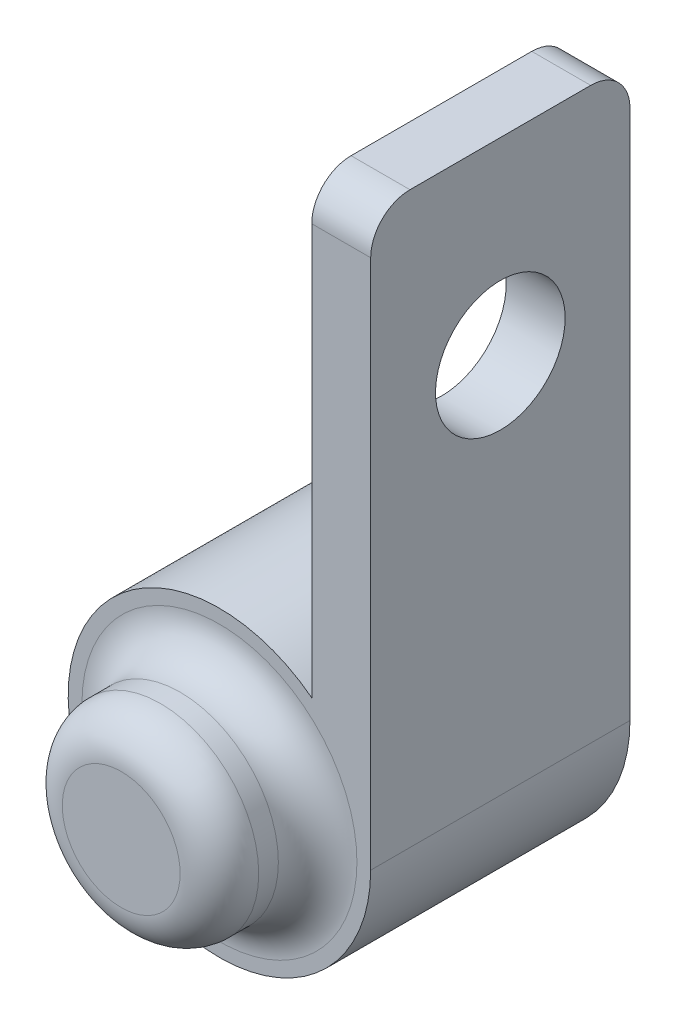
ISO-10303-21;
HEADER;
FILE_DESCRIPTION(('STEP AP214'),'2;1');
FILE_NAME('part.step','',(''),(''),'','','');
FILE_SCHEMA(('AUTOMOTIVE_DESIGN { 1 0 10303 214 1 1 1 1 }'));
ENDSEC;
DATA;
#1=APPLICATION_CONTEXT('core data for automotive mechanical design processes');
#2=APPLICATION_PROTOCOL_DEFINITION('international standard','automotive_design',2000,#1);
#3=PRODUCT_CONTEXT('',#1,'mechanical');
#4=PRODUCT('Part','Part','',(#3));
#5=PRODUCT_RELATED_PRODUCT_CATEGORY('part','',(#4));
#6=PRODUCT_DEFINITION_FORMATION('','',#4);
#7=PRODUCT_DEFINITION_CONTEXT('part definition',#1,'design');
#8=PRODUCT_DEFINITION('design','',#6,#7);
#9=PRODUCT_DEFINITION_SHAPE('','',#8);
#10=(LENGTH_UNIT() NAMED_UNIT(*) SI_UNIT(.MILLI.,.METRE.));
#11=(NAMED_UNIT(*) PLANE_ANGLE_UNIT() SI_UNIT($,.RADIAN.));
#12=(NAMED_UNIT(*) SI_UNIT($,.STERADIAN.) SOLID_ANGLE_UNIT());
#13=UNCERTAINTY_MEASURE_WITH_UNIT(LENGTH_MEASURE(1.E-05),#10,'distance_accuracy_value','');
#14=(GEOMETRIC_REPRESENTATION_CONTEXT(3) GLOBAL_UNCERTAINTY_ASSIGNED_CONTEXT((#13)) GLOBAL_UNIT_ASSIGNED_CONTEXT((#10,
#11,#12)) REPRESENTATION_CONTEXT('',''));
#15=CARTESIAN_POINT('',(0.,0.,0.));
#16=DIRECTION('',(0.,0.,1.));
#17=DIRECTION('',(1.,0.,0.));
#18=AXIS2_PLACEMENT_3D('',#15,#16,#17);
#19=CARTESIAN_POINT('',(0.,0.,6.6));
#20=DIRECTION('',(0.,0.,-1.));
#21=DIRECTION('',(-1.,0.,0.));
#22=AXIS2_PLACEMENT_3D('',#19,#20,#21);
#23=CYLINDRICAL_SURFACE('',#22,3.85);
#24=CARTESIAN_POINT('',(0.,0.,6.6));
#25=DIRECTION('',(0.,0.,1.));
#26=DIRECTION('',(1.,0.,0.));
#27=AXIS2_PLACEMENT_3D('',#24,#25,#26);
#28=CIRCLE('',#27,3.85);
#29=CARTESIAN_POINT('',(2.35,3.04959013639538,6.6));
#30=VERTEX_POINT('',#29);
#31=CARTESIAN_POINT('',(3.85,0.,6.6));
#32=VERTEX_POINT('',#31);
#33=EDGE_CURVE('E101',#30,#32,#28,.T.);
#34=ORIENTED_EDGE('',*,*,#33,.F.);
#35=DIRECTION('',(0.,0.,1.));
#36=VECTOR('',#35,1.);
#37=CARTESIAN_POINT('',(2.35,3.04959013639538,-14.5773797371133));
#38=LINE('',#37,#36);
#39=CARTESIAN_POINT('',(2.35,3.04959013639538,0.));
#40=VERTEX_POINT('',#39);
#41=EDGE_CURVE('E105',#40,#30,#38,.T.);
#42=ORIENTED_EDGE('',*,*,#41,.F.);
#43=CARTESIAN_POINT('',(0.,0.,0.));
#44=DIRECTION('',(0.,0.,1.));
#45=DIRECTION('',(1.,0.,0.));
#46=AXIS2_PLACEMENT_3D('',#43,#44,#45);
#47=CIRCLE('',#46,3.85);
#48=CARTESIAN_POINT('',(3.85,0.,0.));
#49=VERTEX_POINT('',#48);
#50=EDGE_CURVE('E92',#40,#49,#47,.T.);
#51=ORIENTED_EDGE('',*,*,#50,.T.);
#52=DIRECTION('',(0.,0.,1.));
#53=VECTOR('',#52,1.);
#54=CARTESIAN_POINT('',(3.85,0.,-14.5773797371133));
#55=LINE('',#54,#53);
#56=EDGE_CURVE('E125',#49,#32,#55,.T.);
#57=ORIENTED_EDGE('',*,*,#56,.T.);
#58=EDGE_LOOP('',(#34,#42,#51,#57));
#59=FACE_BOUND('',#58,.T.);
#60=ADVANCED_FACE('F37',(#59),#23,.T.);
#61=CARTESIAN_POINT('',(0.,0.,6.6));
#62=DIRECTION('',(0.,0.,1.));
#63=DIRECTION('',(1.,0.,0.));
#64=AXIS2_PLACEMENT_3D('',#61,#62,#63);
#65=PLANE('',#64);
#66=CARTESIAN_POINT('',(0.,0.,6.6));
#67=DIRECTION('',(0.,0.,1.));
#68=DIRECTION('',(1.,0.,0.));
#69=AXIS2_PLACEMENT_3D('',#66,#67,#68);
#70=CIRCLE('',#69,3.5);
#71=CARTESIAN_POINT('',(3.5,0.,6.6));
#72=VERTEX_POINT('',#71);
#73=EDGE_CURVE('E138',#72,#72,#70,.F.);
#74=ORIENTED_EDGE('',*,*,#73,.T.);
#75=EDGE_LOOP('',(#74));
#76=FACE_BOUND('',#75,.T.);
#77=DIRECTION('',(0.,1.,0.));
#78=VECTOR('',#77,1.);
#79=CARTESIAN_POINT('',(3.85,0.,6.6));
#80=LINE('',#79,#78);
#81=CARTESIAN_POINT('',(3.85,13.5,6.6));
#82=VERTEX_POINT('',#81);
#83=EDGE_CURVE('E120',#32,#82,#80,.T.);
#84=ORIENTED_EDGE('',*,*,#83,.T.);
#85=DIRECTION('',(-1.,0.,0.));
#86=VECTOR('',#85,1.);
#87=CARTESIAN_POINT('',(0.,13.5,6.6));
#88=LINE('',#87,#86);
#89=CARTESIAN_POINT('',(2.35,13.5,6.6));
#90=VERTEX_POINT('',#89);
#91=EDGE_CURVE('E144',#82,#90,#88,.T.);
#92=ORIENTED_EDGE('',*,*,#91,.T.);
#93=DIRECTION('',(0.,-1.,0.));
#94=VECTOR('',#93,1.);
#95=CARTESIAN_POINT('',(2.35,14.5,6.6));
#96=LINE('',#95,#94);
#97=EDGE_CURVE('E123',#90,#30,#96,.T.);
#98=ORIENTED_EDGE('',*,*,#97,.T.);
#99=ORIENTED_EDGE('',*,*,#33,.T.);
#100=EDGE_LOOP('',(#84,#92,#98,#99));
#101=FACE_BOUND('',#100,.T.);
#102=ADVANCED_FACE('F162',(#76,#101),#65,.T.);
#103=CARTESIAN_POINT('',(0.,0.,0.));
#104=DIRECTION('',(0.,0.,1.));
#105=DIRECTION('',(1.,0.,0.));
#106=AXIS2_PLACEMENT_3D('',#103,#104,#105);
#107=PLANE('',#106);
#108=DIRECTION('',(0.,1.,0.));
#109=VECTOR('',#108,1.);
#110=CARTESIAN_POINT('',(2.35,14.5,0.));
#111=LINE('',#110,#109);
#112=CARTESIAN_POINT('',(2.35,13.5,0.));
#113=VERTEX_POINT('',#112);
#114=EDGE_CURVE('E96',#40,#113,#111,.T.);
#115=ORIENTED_EDGE('',*,*,#114,.T.);
#116=DIRECTION('',(1.,0.,0.));
#117=VECTOR('',#116,1.);
#118=CARTESIAN_POINT('',(3.85,13.5,0.));
#119=LINE('',#118,#117);
#120=CARTESIAN_POINT('',(3.85,13.5,0.));
#121=VERTEX_POINT('',#120);
#122=EDGE_CURVE('E12',#113,#121,#119,.T.);
#123=ORIENTED_EDGE('',*,*,#122,.T.);
#124=DIRECTION('',(0.,-1.,0.));
#125=VECTOR('',#124,1.);
#126=CARTESIAN_POINT('',(3.85,0.,0.));
#127=LINE('',#126,#125);
#128=EDGE_CURVE('E98',#121,#49,#127,.T.);
#129=ORIENTED_EDGE('',*,*,#128,.T.);
#130=ORIENTED_EDGE('',*,*,#50,.F.);
#131=EDGE_LOOP('',(#115,#123,#129,#130));
#132=FACE_BOUND('',#131,.T.);
#133=ADVANCED_FACE('F94',(#132),#107,.F.);
#134=CARTESIAN_POINT('',(2.35,14.5,-14.5773797371133));
#135=DIRECTION('',(-1.,0.,0.));
#136=DIRECTION('',(0.,-1.,0.));
#137=AXIS2_PLACEMENT_3D('',#134,#135,#136);
#138=PLANE('',#137);
#139=CARTESIAN_POINT('',(2.35,9.7,3.3));
#140=DIRECTION('',(-1.,0.,0.));
#141=DIRECTION('',(0.,-1.,0.));
#142=AXIS2_PLACEMENT_3D('',#139,#140,#141);
#143=CIRCLE('',#142,1.65);
#144=CARTESIAN_POINT('',(2.35,8.05,3.3));
#145=VERTEX_POINT('',#144);
#146=EDGE_CURVE('E119',#145,#145,#143,.T.);
#147=ORIENTED_EDGE('',*,*,#146,.F.);
#148=EDGE_LOOP('',(#147));
#149=FACE_BOUND('',#148,.T.);
#150=ORIENTED_EDGE('',*,*,#97,.F.);
#151=CARTESIAN_POINT('',(2.35,13.5,5.6));
#152=DIRECTION('',(-1.,0.,0.));
#153=DIRECTION('',(0.,-1.,0.));
#154=AXIS2_PLACEMENT_3D('',#151,#152,#153);
#155=CIRCLE('',#154,1.);
#156=CARTESIAN_POINT('',(2.35,14.5,5.6));
#157=VERTEX_POINT('',#156);
#158=EDGE_CURVE('E150',#90,#157,#155,.T.);
#159=ORIENTED_EDGE('',*,*,#158,.T.);
#160=DIRECTION('',(0.,0.,1.));
#161=VECTOR('',#160,1.);
#162=CARTESIAN_POINT('',(2.35,14.5,-14.5773797371133));
#163=LINE('',#162,#161);
#164=CARTESIAN_POINT('',(2.35,14.5,0.999999999999999));
#165=VERTEX_POINT('',#164);
#166=EDGE_CURVE('E109',#165,#157,#163,.T.);
#167=ORIENTED_EDGE('',*,*,#166,.F.);
#168=CARTESIAN_POINT('',(2.35,13.5,1.));
#169=DIRECTION('',(-1.,0.,0.));
#170=DIRECTION('',(0.,-1.,0.));
#171=AXIS2_PLACEMENT_3D('',#168,#169,#170);
#172=CIRCLE('',#171,1.);
#173=EDGE_CURVE('E114',#165,#113,#172,.T.);
#174=ORIENTED_EDGE('',*,*,#173,.T.);
#175=ORIENTED_EDGE('',*,*,#114,.F.);
#176=ORIENTED_EDGE('',*,*,#41,.T.);
#177=EDGE_LOOP('',(#150,#159,#167,#174,#175,#176));
#178=FACE_BOUND('',#177,.T.);
#179=ADVANCED_FACE('F111',(#149,#178),#138,.T.);
#180=CARTESIAN_POINT('',(3.85,14.5,-14.5773797371133));
#181=DIRECTION('',(0.,1.,0.));
#182=DIRECTION('',(0.,0.,1.));
#183=AXIS2_PLACEMENT_3D('',#180,#181,#182);
#184=PLANE('',#183);
#185=ORIENTED_EDGE('',*,*,#166,.T.);
#186=DIRECTION('',(-1.,0.,0.));
#187=VECTOR('',#186,1.);
#188=CARTESIAN_POINT('',(3.85,14.5,5.6));
#189=LINE('',#188,#187);
#190=CARTESIAN_POINT('',(3.85,14.5,5.6));
#191=VERTEX_POINT('',#190);
#192=EDGE_CURVE('E59',#157,#191,#189,.F.);
#193=ORIENTED_EDGE('',*,*,#192,.T.);
#194=DIRECTION('',(0.,0.,1.));
#195=VECTOR('',#194,1.);
#196=CARTESIAN_POINT('',(3.85,14.5,-14.5773797371133));
#197=LINE('',#196,#195);
#198=CARTESIAN_POINT('',(3.85,14.5,0.999999999999999));
#199=VERTEX_POINT('',#198);
#200=EDGE_CURVE('E128',#199,#191,#197,.T.);
#201=ORIENTED_EDGE('',*,*,#200,.F.);
#202=DIRECTION('',(1.,0.,0.));
#203=VECTOR('',#202,1.);
#204=CARTESIAN_POINT('',(2.35,14.5,1.));
#205=LINE('',#204,#203);
#206=EDGE_CURVE('E152',#199,#165,#205,.F.);
#207=ORIENTED_EDGE('',*,*,#206,.T.);
#208=EDGE_LOOP('',(#185,#193,#201,#207));
#209=FACE_BOUND('',#208,.T.);
#210=ADVANCED_FACE('F164',(#209),#184,.T.);
#211=CARTESIAN_POINT('',(3.85,0.,-14.5773797371133));
#212=DIRECTION('',(1.,0.,0.));
#213=DIRECTION('',(0.,0.,-1.));
#214=AXIS2_PLACEMENT_3D('',#211,#212,#213);
#215=PLANE('',#214);
#216=CARTESIAN_POINT('',(3.85,9.7,3.3));
#217=DIRECTION('',(1.,0.,0.));
#218=DIRECTION('',(0.,0.,-1.));
#219=AXIS2_PLACEMENT_3D('',#216,#217,#218);
#220=CIRCLE('',#219,1.65);
#221=CARTESIAN_POINT('',(3.85,9.7,1.65));
#222=VERTEX_POINT('',#221);
#223=EDGE_CURVE('E124',#222,#222,#220,.T.);
#224=ORIENTED_EDGE('',*,*,#223,.F.);
#225=EDGE_LOOP('',(#224));
#226=FACE_BOUND('',#225,.T.);
#227=ORIENTED_EDGE('',*,*,#200,.T.);
#228=CARTESIAN_POINT('',(3.85,13.5,5.6));
#229=DIRECTION('',(1.,0.,0.));
#230=DIRECTION('',(0.,0.,-1.));
#231=AXIS2_PLACEMENT_3D('',#228,#229,#230);
#232=CIRCLE('',#231,1.);
#233=EDGE_CURVE('E45',#191,#82,#232,.T.);
#234=ORIENTED_EDGE('',*,*,#233,.T.);
#235=ORIENTED_EDGE('',*,*,#83,.F.);
#236=ORIENTED_EDGE('',*,*,#56,.F.);
#237=ORIENTED_EDGE('',*,*,#128,.F.);
#238=CARTESIAN_POINT('',(3.85,13.5,1.));
#239=DIRECTION('',(1.,0.,0.));
#240=DIRECTION('',(0.,0.,-1.));
#241=AXIS2_PLACEMENT_3D('',#238,#239,#240);
#242=CIRCLE('',#241,1.);
#243=EDGE_CURVE('E52',#121,#199,#242,.T.);
#244=ORIENTED_EDGE('',*,*,#243,.T.);
#245=EDGE_LOOP('',(#227,#234,#235,#236,#237,#244));
#246=FACE_BOUND('',#245,.T.);
#247=ADVANCED_FACE('F158',(#226,#246),#215,.T.);
#248=CARTESIAN_POINT('',(0.,0.,25.2710678118655));
#249=DIRECTION('',(0.,0.,-1.));
#250=DIRECTION('',(-1.,0.,0.));
#251=AXIS2_PLACEMENT_3D('',#248,#249,#250);
#252=CYLINDRICAL_SURFACE('',#251,2.5);
#253=CARTESIAN_POINT('',(0.,0.,7.6));
#254=DIRECTION('',(0.,0.,1.));
#255=DIRECTION('',(1.,0.,0.));
#256=AXIS2_PLACEMENT_3D('',#253,#254,#255);
#257=CIRCLE('',#256,2.5);
#258=CARTESIAN_POINT('',(2.5,0.,7.6));
#259=VERTEX_POINT('',#258);
#260=EDGE_CURVE('E135',#259,#259,#257,.T.);
#261=ORIENTED_EDGE('',*,*,#260,.T.);
#262=EDGE_LOOP('',(#261));
#263=FACE_BOUND('',#262,.T.);
#264=CARTESIAN_POINT('',(0.,0.,8.1));
#265=DIRECTION('',(0.,0.,1.));
#266=DIRECTION('',(1.,0.,0.));
#267=AXIS2_PLACEMENT_3D('',#264,#265,#266);
#268=CIRCLE('',#267,2.5);
#269=CARTESIAN_POINT('',(2.5,0.,8.1));
#270=VERTEX_POINT('',#269);
#271=EDGE_CURVE('E131',#270,#270,#268,.F.);
#272=ORIENTED_EDGE('',*,*,#271,.T.);
#273=EDGE_LOOP('',(#272));
#274=FACE_BOUND('',#273,.T.);
#275=ADVANCED_FACE('F197',(#263,#274),#252,.T.);
#276=CARTESIAN_POINT('',(0.,0.,9.1));
#277=DIRECTION('',(0.,0.,1.));
#278=DIRECTION('',(1.,0.,0.));
#279=AXIS2_PLACEMENT_3D('',#276,#277,#278);
#280=PLANE('',#279);
#281=CARTESIAN_POINT('',(0.,0.,9.1));
#282=DIRECTION('',(0.,0.,1.));
#283=DIRECTION('',(1.,0.,0.));
#284=AXIS2_PLACEMENT_3D('',#281,#282,#283);
#285=CIRCLE('',#284,1.5);
#286=CARTESIAN_POINT('',(1.5,0.,9.1));
#287=VERTEX_POINT('',#286);
#288=EDGE_CURVE('E141',#287,#287,#285,.T.);
#289=ORIENTED_EDGE('',*,*,#288,.T.);
#290=EDGE_LOOP('',(#289));
#291=FACE_BOUND('',#290,.T.);
#292=ADVANCED_FACE('F183',(#291),#280,.T.);
#293=CARTESIAN_POINT('',(0.,0.,7.6));
#294=DIRECTION('',(0.,0.,1.));
#295=DIRECTION('',(1.,0.,0.));
#296=AXIS2_PLACEMENT_3D('',#293,#294,#295);
#297=TOROIDAL_SURFACE('',#296,3.5,1.);
#298=ORIENTED_EDGE('',*,*,#73,.F.);
#299=EDGE_LOOP('',(#298));
#300=FACE_BOUND('',#299,.T.);
#301=ORIENTED_EDGE('',*,*,#260,.F.);
#302=EDGE_LOOP('',(#301));
#303=FACE_BOUND('',#302,.T.);
#304=ADVANCED_FACE('F179',(#300,#303),#297,.F.);
#305=CARTESIAN_POINT('',(0.,0.,8.1));
#306=DIRECTION('',(0.,0.,1.));
#307=DIRECTION('',(1.,0.,0.));
#308=AXIS2_PLACEMENT_3D('',#305,#306,#307);
#309=TOROIDAL_SURFACE('',#308,1.5,1.);
#310=ORIENTED_EDGE('',*,*,#271,.F.);
#311=EDGE_LOOP('',(#310));
#312=FACE_BOUND('',#311,.T.);
#313=ORIENTED_EDGE('',*,*,#288,.F.);
#314=EDGE_LOOP('',(#313));
#315=FACE_BOUND('',#314,.T.);
#316=ADVANCED_FACE('F182',(#312,#315),#309,.T.);
#317=CARTESIAN_POINT('',(12.95,9.7,3.3));
#318=DIRECTION('',(-1.,0.,0.));
#319=DIRECTION('',(0.,-1.,0.));
#320=AXIS2_PLACEMENT_3D('',#317,#318,#319);
#321=CYLINDRICAL_SURFACE('',#320,1.65);
#322=ORIENTED_EDGE('',*,*,#223,.T.);
#323=EDGE_LOOP('',(#322));
#324=FACE_BOUND('',#323,.T.);
#325=ORIENTED_EDGE('',*,*,#146,.T.);
#326=EDGE_LOOP('',(#325));
#327=FACE_BOUND('',#326,.T.);
#328=ADVANCED_FACE('F169',(#324,#327),#321,.F.);
#329=CARTESIAN_POINT('',(0.,13.5,5.6));
#330=DIRECTION('',(-1.,0.,0.));
#331=DIRECTION('',(0.,0.,1.));
#332=AXIS2_PLACEMENT_3D('',#329,#330,#331);
#333=CYLINDRICAL_SURFACE('',#332,1.);
#334=ORIENTED_EDGE('',*,*,#233,.F.);
#335=ORIENTED_EDGE('',*,*,#192,.F.);
#336=ORIENTED_EDGE('',*,*,#158,.F.);
#337=ORIENTED_EDGE('',*,*,#91,.F.);
#338=EDGE_LOOP('',(#334,#335,#336,#337));
#339=FACE_BOUND('',#338,.T.);
#340=ADVANCED_FACE('F163',(#339),#333,.T.);
#341=CARTESIAN_POINT('',(0.,13.5,1.));
#342=DIRECTION('',(-1.,0.,0.));
#343=DIRECTION('',(0.,0.,1.));
#344=AXIS2_PLACEMENT_3D('',#341,#342,#343);
#345=CYLINDRICAL_SURFACE('',#344,1.);
#346=ORIENTED_EDGE('',*,*,#173,.F.);
#347=ORIENTED_EDGE('',*,*,#206,.F.);
#348=ORIENTED_EDGE('',*,*,#243,.F.);
#349=ORIENTED_EDGE('',*,*,#122,.F.);
#350=EDGE_LOOP('',(#346,#347,#348,#349));
#351=FACE_BOUND('',#350,.T.);
#352=ADVANCED_FACE('F39',(#351),#345,.T.);
#353=CLOSED_SHELL('',(#60,#102,#133,#179,#210,#247,#275,#292,#304,#316,#328,#340,#352));
#354=MANIFOLD_SOLID_BREP('B2',#353);
#355=ADVANCED_BREP_SHAPE_REPRESENTATION('',(#18,#354),#14);
#356=SHAPE_DEFINITION_REPRESENTATION(#9,#355);
ENDSEC;
END-ISO-10303-21;
